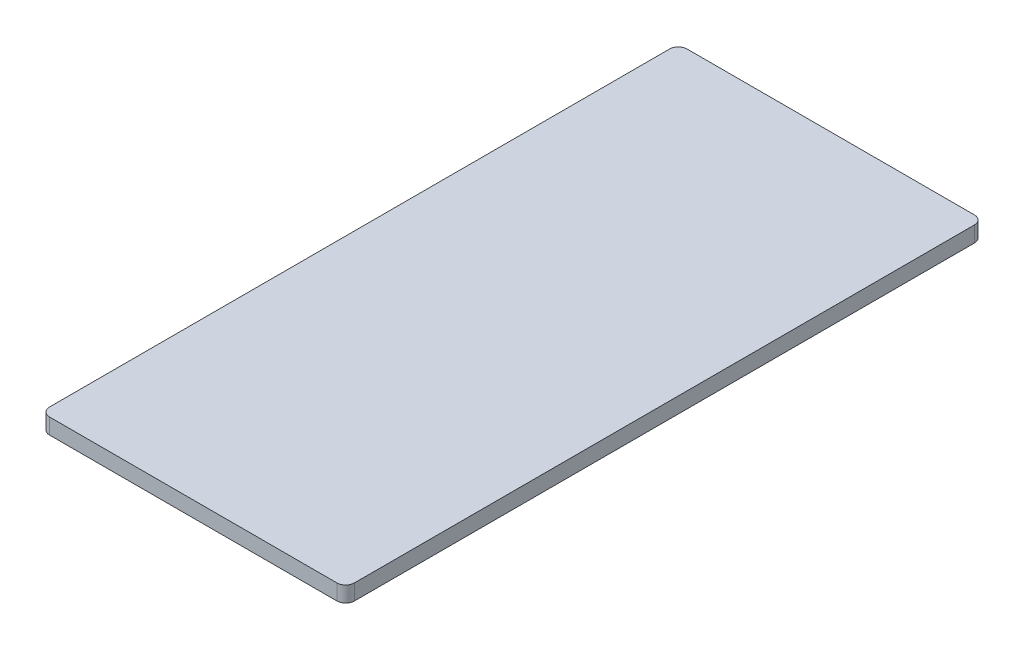
ISO-10303-21;
HEADER;
FILE_DESCRIPTION(('STEP AP214'),'2;1');
FILE_NAME('part.step','',(''),(''),'','','');
FILE_SCHEMA(('AUTOMOTIVE_DESIGN { 1 0 10303 214 1 1 1 1 }'));
ENDSEC;
DATA;
#1=APPLICATION_CONTEXT('core data for automotive mechanical design processes');
#2=APPLICATION_PROTOCOL_DEFINITION('international standard','automotive_design',2000,#1);
#3=PRODUCT_CONTEXT('',#1,'mechanical');
#4=PRODUCT('Part','Part','',(#3));
#5=PRODUCT_RELATED_PRODUCT_CATEGORY('part','',(#4));
#6=PRODUCT_DEFINITION_FORMATION('','',#4);
#7=PRODUCT_DEFINITION_CONTEXT('part definition',#1,'design');
#8=PRODUCT_DEFINITION('design','',#6,#7);
#9=PRODUCT_DEFINITION_SHAPE('','',#8);
#10=(LENGTH_UNIT() NAMED_UNIT(*) SI_UNIT(.MILLI.,.METRE.));
#11=(NAMED_UNIT(*) PLANE_ANGLE_UNIT() SI_UNIT($,.RADIAN.));
#12=(NAMED_UNIT(*) SI_UNIT($,.STERADIAN.) SOLID_ANGLE_UNIT());
#13=UNCERTAINTY_MEASURE_WITH_UNIT(LENGTH_MEASURE(1.E-05),#10,'distance_accuracy_value','');
#14=(GEOMETRIC_REPRESENTATION_CONTEXT(3) GLOBAL_UNCERTAINTY_ASSIGNED_CONTEXT((#13)) GLOBAL_UNIT_ASSIGNED_CONTEXT((#10,
#11,#12)) REPRESENTATION_CONTEXT('',''));
#15=CARTESIAN_POINT('',(0.,0.,0.));
#16=DIRECTION('',(0.,0.,1.));
#17=DIRECTION('',(1.,0.,0.));
#18=AXIS2_PLACEMENT_3D('',#15,#16,#17);
#19=CARTESIAN_POINT('',(-175.,18.,366.));
#20=DIRECTION('',(1.,0.,0.));
#21=DIRECTION('',(0.,0.,-1.));
#22=AXIS2_PLACEMENT_3D('',#19,#20,#21);
#23=PLANE('',#22);
#24=DIRECTION('',(0.,0.,1.));
#25=VECTOR('',#24,1.);
#26=CARTESIAN_POINT('',(-175.,18.,366.));
#27=LINE('',#26,#25);
#28=CARTESIAN_POINT('',(-175.,18.,-356.));
#29=VERTEX_POINT('',#28);
#30=CARTESIAN_POINT('',(-175.,18.,356.));
#31=VERTEX_POINT('',#30);
#32=EDGE_CURVE('E122',#29,#31,#27,.T.);
#33=ORIENTED_EDGE('',*,*,#32,.F.);
#34=DIRECTION('',(0.,-1.,0.));
#35=VECTOR('',#34,1.);
#36=CARTESIAN_POINT('',(-175.,18.,-356.));
#37=LINE('',#36,#35);
#38=CARTESIAN_POINT('',(-175.,0.,-356.));
#39=VERTEX_POINT('',#38);
#40=EDGE_CURVE('E107',#29,#39,#37,.T.);
#41=ORIENTED_EDGE('',*,*,#40,.T.);
#42=DIRECTION('',(0.,0.,1.));
#43=VECTOR('',#42,1.);
#44=CARTESIAN_POINT('',(-175.,0.,366.));
#45=LINE('',#44,#43);
#46=CARTESIAN_POINT('',(-175.,0.,356.));
#47=VERTEX_POINT('',#46);
#48=EDGE_CURVE('E119',#39,#47,#45,.T.);
#49=ORIENTED_EDGE('',*,*,#48,.T.);
#50=DIRECTION('',(0.,-1.,0.));
#51=VECTOR('',#50,1.);
#52=CARTESIAN_POINT('',(-175.,18.,356.));
#53=LINE('',#52,#51);
#54=EDGE_CURVE('E124',#47,#31,#53,.F.);
#55=ORIENTED_EDGE('',*,*,#54,.T.);
#56=EDGE_LOOP('',(#33,#41,#49,#55));
#57=FACE_BOUND('',#56,.T.);
#58=ADVANCED_FACE('F37',(#57),#23,.F.);
#59=CARTESIAN_POINT('',(-175.,18.,366.));
#60=DIRECTION('',(0.,0.,-1.));
#61=DIRECTION('',(-1.,0.,0.));
#62=AXIS2_PLACEMENT_3D('',#59,#60,#61);
#63=PLANE('',#62);
#64=DIRECTION('',(1.,0.,0.));
#65=VECTOR('',#64,1.);
#66=CARTESIAN_POINT('',(-175.,0.,366.));
#67=LINE('',#66,#65);
#68=CARTESIAN_POINT('',(-165.,0.,366.));
#69=VERTEX_POINT('',#68);
#70=CARTESIAN_POINT('',(165.,0.,366.));
#71=VERTEX_POINT('',#70);
#72=EDGE_CURVE('E128',#69,#71,#67,.T.);
#73=ORIENTED_EDGE('',*,*,#72,.T.);
#74=DIRECTION('',(0.,-1.,0.));
#75=VECTOR('',#74,1.);
#76=CARTESIAN_POINT('',(165.,18.,366.));
#77=LINE('',#76,#75);
#78=CARTESIAN_POINT('',(165.,18.,366.));
#79=VERTEX_POINT('',#78);
#80=EDGE_CURVE('E11',#71,#79,#77,.F.);
#81=ORIENTED_EDGE('',*,*,#80,.T.);
#82=DIRECTION('',(1.,0.,0.));
#83=VECTOR('',#82,1.);
#84=CARTESIAN_POINT('',(-175.,18.,366.));
#85=LINE('',#84,#83);
#86=CARTESIAN_POINT('',(-165.,18.,366.));
#87=VERTEX_POINT('',#86);
#88=EDGE_CURVE('E164',#87,#79,#85,.T.);
#89=ORIENTED_EDGE('',*,*,#88,.F.);
#90=DIRECTION('',(0.,-1.,0.));
#91=VECTOR('',#90,1.);
#92=CARTESIAN_POINT('',(-165.,18.,366.));
#93=LINE('',#92,#91);
#94=EDGE_CURVE('E45',#87,#69,#93,.T.);
#95=ORIENTED_EDGE('',*,*,#94,.T.);
#96=EDGE_LOOP('',(#73,#81,#89,#95));
#97=FACE_BOUND('',#96,.T.);
#98=ADVANCED_FACE('F162',(#97),#63,.F.);
#99=CARTESIAN_POINT('',(175.,18.,366.));
#100=DIRECTION('',(-1.,0.,0.));
#101=DIRECTION('',(0.,0.,1.));
#102=AXIS2_PLACEMENT_3D('',#99,#100,#101);
#103=PLANE('',#102);
#104=DIRECTION('',(0.,0.,-1.));
#105=VECTOR('',#104,1.);
#106=CARTESIAN_POINT('',(175.,0.,366.));
#107=LINE('',#106,#105);
#108=CARTESIAN_POINT('',(175.,0.,356.));
#109=VERTEX_POINT('',#108);
#110=CARTESIAN_POINT('',(175.,0.,-356.));
#111=VERTEX_POINT('',#110);
#112=EDGE_CURVE('E131',#109,#111,#107,.T.);
#113=ORIENTED_EDGE('',*,*,#112,.T.);
#114=DIRECTION('',(0.,-1.,0.));
#115=VECTOR('',#114,1.);
#116=CARTESIAN_POINT('',(175.,18.,-356.));
#117=LINE('',#116,#115);
#118=CARTESIAN_POINT('',(175.,18.,-356.));
#119=VERTEX_POINT('',#118);
#120=EDGE_CURVE('E52',#111,#119,#117,.F.);
#121=ORIENTED_EDGE('',*,*,#120,.T.);
#122=DIRECTION('',(0.,0.,-1.));
#123=VECTOR('',#122,1.);
#124=CARTESIAN_POINT('',(175.,18.,366.));
#125=LINE('',#124,#123);
#126=CARTESIAN_POINT('',(175.,18.,356.));
#127=VERTEX_POINT('',#126);
#128=EDGE_CURVE('E172',#127,#119,#125,.T.);
#129=ORIENTED_EDGE('',*,*,#128,.F.);
#130=DIRECTION('',(0.,-1.,0.));
#131=VECTOR('',#130,1.);
#132=CARTESIAN_POINT('',(175.,18.,356.));
#133=LINE('',#132,#131);
#134=EDGE_CURVE('E155',#127,#109,#133,.T.);
#135=ORIENTED_EDGE('',*,*,#134,.T.);
#136=EDGE_LOOP('',(#113,#121,#129,#135));
#137=FACE_BOUND('',#136,.T.);
#138=ADVANCED_FACE('F171',(#137),#103,.F.);
#139=CARTESIAN_POINT('',(-175.,18.,-366.));
#140=DIRECTION('',(0.,0.,1.));
#141=DIRECTION('',(1.,0.,0.));
#142=AXIS2_PLACEMENT_3D('',#139,#140,#141);
#143=PLANE('',#142);
#144=DIRECTION('',(-1.,0.,0.));
#145=VECTOR('',#144,1.);
#146=CARTESIAN_POINT('',(-175.,0.,-366.));
#147=LINE('',#146,#145);
#148=CARTESIAN_POINT('',(165.,0.,-366.));
#149=VERTEX_POINT('',#148);
#150=CARTESIAN_POINT('',(-165.,0.,-366.));
#151=VERTEX_POINT('',#150);
#152=EDGE_CURVE('E138',#149,#151,#147,.T.);
#153=ORIENTED_EDGE('',*,*,#152,.T.);
#154=DIRECTION('',(0.,-1.,0.));
#155=VECTOR('',#154,1.);
#156=CARTESIAN_POINT('',(-165.,18.,-366.));
#157=LINE('',#156,#155);
#158=CARTESIAN_POINT('',(-165.,18.,-366.));
#159=VERTEX_POINT('',#158);
#160=EDGE_CURVE('E108',#151,#159,#157,.F.);
#161=ORIENTED_EDGE('',*,*,#160,.T.);
#162=DIRECTION('',(-1.,0.,0.));
#163=VECTOR('',#162,1.);
#164=CARTESIAN_POINT('',(-175.,18.,-366.));
#165=LINE('',#164,#163);
#166=CARTESIAN_POINT('',(165.,18.,-366.));
#167=VERTEX_POINT('',#166);
#168=EDGE_CURVE('E134',#167,#159,#165,.T.);
#169=ORIENTED_EDGE('',*,*,#168,.F.);
#170=DIRECTION('',(0.,-1.,0.));
#171=VECTOR('',#170,1.);
#172=CARTESIAN_POINT('',(165.,18.,-366.));
#173=LINE('',#172,#171);
#174=EDGE_CURVE('E113',#167,#149,#173,.T.);
#175=ORIENTED_EDGE('',*,*,#174,.T.);
#176=EDGE_LOOP('',(#153,#161,#169,#175));
#177=FACE_BOUND('',#176,.T.);
#178=ADVANCED_FACE('F200',(#177),#143,.F.);
#179=CARTESIAN_POINT('',(0.,18.,0.));
#180=DIRECTION('',(0.,-1.,0.));
#181=DIRECTION('',(0.,0.,-1.));
#182=AXIS2_PLACEMENT_3D('',#179,#180,#181);
#183=PLANE('',#182);
#184=ORIENTED_EDGE('',*,*,#168,.T.);
#185=CARTESIAN_POINT('',(-165.,18.,-356.));
#186=DIRECTION('',(0.,-1.,0.));
#187=DIRECTION('',(0.,0.,-1.));
#188=AXIS2_PLACEMENT_3D('',#185,#186,#187);
#189=CIRCLE('',#188,10.);
#190=EDGE_CURVE('E153',#159,#29,#189,.F.);
#191=ORIENTED_EDGE('',*,*,#190,.T.);
#192=ORIENTED_EDGE('',*,*,#32,.T.);
#193=CARTESIAN_POINT('',(-165.,18.,356.));
#194=DIRECTION('',(0.,-1.,0.));
#195=DIRECTION('',(0.,0.,-1.));
#196=AXIS2_PLACEMENT_3D('',#193,#194,#195);
#197=CIRCLE('',#196,10.);
#198=EDGE_CURVE('E148',#31,#87,#197,.F.);
#199=ORIENTED_EDGE('',*,*,#198,.T.);
#200=ORIENTED_EDGE('',*,*,#88,.T.);
#201=CARTESIAN_POINT('',(165.,18.,356.));
#202=DIRECTION('',(0.,-1.,0.));
#203=DIRECTION('',(0.,0.,-1.));
#204=AXIS2_PLACEMENT_3D('',#201,#202,#203);
#205=CIRCLE('',#204,10.);
#206=EDGE_CURVE('E59',#79,#127,#205,.F.);
#207=ORIENTED_EDGE('',*,*,#206,.T.);
#208=ORIENTED_EDGE('',*,*,#128,.T.);
#209=CARTESIAN_POINT('',(165.,18.,-356.));
#210=DIRECTION('',(0.,-1.,0.));
#211=DIRECTION('',(0.,0.,-1.));
#212=AXIS2_PLACEMENT_3D('',#209,#210,#211);
#213=CIRCLE('',#212,10.);
#214=EDGE_CURVE('E151',#119,#167,#213,.F.);
#215=ORIENTED_EDGE('',*,*,#214,.T.);
#216=EDGE_LOOP('',(#184,#191,#192,#199,#200,#207,#208,#215));
#217=FACE_BOUND('',#216,.T.);
#218=ADVANCED_FACE('F177',(#217),#183,.F.);
#219=CARTESIAN_POINT('',(0.,0.,0.));
#220=DIRECTION('',(0.,-1.,0.));
#221=DIRECTION('',(0.,0.,-1.));
#222=AXIS2_PLACEMENT_3D('',#219,#220,#221);
#223=PLANE('',#222);
#224=ORIENTED_EDGE('',*,*,#48,.F.);
#225=CARTESIAN_POINT('',(-165.,0.,-356.));
#226=DIRECTION('',(0.,-1.,0.));
#227=DIRECTION('',(0.,0.,-1.));
#228=AXIS2_PLACEMENT_3D('',#225,#226,#227);
#229=CIRCLE('',#228,10.);
#230=EDGE_CURVE('E103',#39,#151,#229,.T.);
#231=ORIENTED_EDGE('',*,*,#230,.T.);
#232=ORIENTED_EDGE('',*,*,#152,.F.);
#233=CARTESIAN_POINT('',(165.,0.,-356.));
#234=DIRECTION('',(0.,-1.,0.));
#235=DIRECTION('',(0.,0.,-1.));
#236=AXIS2_PLACEMENT_3D('',#233,#234,#235);
#237=CIRCLE('',#236,10.);
#238=EDGE_CURVE('E114',#149,#111,#237,.T.);
#239=ORIENTED_EDGE('',*,*,#238,.T.);
#240=ORIENTED_EDGE('',*,*,#112,.F.);
#241=CARTESIAN_POINT('',(165.,0.,356.));
#242=DIRECTION('',(0.,-1.,0.));
#243=DIRECTION('',(0.,0.,-1.));
#244=AXIS2_PLACEMENT_3D('',#241,#242,#243);
#245=CIRCLE('',#244,10.);
#246=EDGE_CURVE('E142',#109,#71,#245,.T.);
#247=ORIENTED_EDGE('',*,*,#246,.T.);
#248=ORIENTED_EDGE('',*,*,#72,.F.);
#249=CARTESIAN_POINT('',(-165.,0.,356.));
#250=DIRECTION('',(0.,-1.,0.));
#251=DIRECTION('',(0.,0.,-1.));
#252=AXIS2_PLACEMENT_3D('',#249,#250,#251);
#253=CIRCLE('',#252,10.);
#254=EDGE_CURVE('E123',#69,#47,#253,.T.);
#255=ORIENTED_EDGE('',*,*,#254,.T.);
#256=EDGE_LOOP('',(#224,#231,#232,#239,#240,#247,#248,#255));
#257=FACE_BOUND('',#256,.T.);
#258=ADVANCED_FACE('F126',(#257),#223,.T.);
#259=CARTESIAN_POINT('',(-165.,18.,-356.));
#260=DIRECTION('',(0.,-1.,0.));
#261=DIRECTION('',(0.,0.,-1.));
#262=AXIS2_PLACEMENT_3D('',#259,#260,#261);
#263=CYLINDRICAL_SURFACE('',#262,10.);
#264=ORIENTED_EDGE('',*,*,#190,.F.);
#265=ORIENTED_EDGE('',*,*,#160,.F.);
#266=ORIENTED_EDGE('',*,*,#230,.F.);
#267=ORIENTED_EDGE('',*,*,#40,.F.);
#268=EDGE_LOOP('',(#264,#265,#266,#267));
#269=FACE_BOUND('',#268,.T.);
#270=ADVANCED_FACE('F106',(#269),#263,.T.);
#271=CARTESIAN_POINT('',(165.,18.,-356.));
#272=DIRECTION('',(0.,-1.,0.));
#273=DIRECTION('',(0.,0.,-1.));
#274=AXIS2_PLACEMENT_3D('',#271,#272,#273);
#275=CYLINDRICAL_SURFACE('',#274,10.);
#276=ORIENTED_EDGE('',*,*,#214,.F.);
#277=ORIENTED_EDGE('',*,*,#120,.F.);
#278=ORIENTED_EDGE('',*,*,#238,.F.);
#279=ORIENTED_EDGE('',*,*,#174,.F.);
#280=EDGE_LOOP('',(#276,#277,#278,#279));
#281=FACE_BOUND('',#280,.T.);
#282=ADVANCED_FACE('F182',(#281),#275,.T.);
#283=CARTESIAN_POINT('',(165.,18.,356.));
#284=DIRECTION('',(0.,-1.,0.));
#285=DIRECTION('',(0.,0.,-1.));
#286=AXIS2_PLACEMENT_3D('',#283,#284,#285);
#287=CYLINDRICAL_SURFACE('',#286,10.);
#288=ORIENTED_EDGE('',*,*,#206,.F.);
#289=ORIENTED_EDGE('',*,*,#80,.F.);
#290=ORIENTED_EDGE('',*,*,#246,.F.);
#291=ORIENTED_EDGE('',*,*,#134,.F.);
#292=EDGE_LOOP('',(#288,#289,#290,#291));
#293=FACE_BOUND('',#292,.T.);
#294=ADVANCED_FACE('F170',(#293),#287,.T.);
#295=CARTESIAN_POINT('',(-165.,18.,356.));
#296=DIRECTION('',(0.,-1.,0.));
#297=DIRECTION('',(0.,0.,-1.));
#298=AXIS2_PLACEMENT_3D('',#295,#296,#297);
#299=CYLINDRICAL_SURFACE('',#298,10.);
#300=ORIENTED_EDGE('',*,*,#198,.F.);
#301=ORIENTED_EDGE('',*,*,#54,.F.);
#302=ORIENTED_EDGE('',*,*,#254,.F.);
#303=ORIENTED_EDGE('',*,*,#94,.F.);
#304=EDGE_LOOP('',(#300,#301,#302,#303));
#305=FACE_BOUND('',#304,.T.);
#306=ADVANCED_FACE('F39',(#305),#299,.T.);
#307=CLOSED_SHELL('',(#58,#98,#138,#178,#218,#258,#270,#282,#294,#306));
#308=MANIFOLD_SOLID_BREP('B2',#307);
#309=ADVANCED_BREP_SHAPE_REPRESENTATION('',(#18,#308),#14);
#310=SHAPE_DEFINITION_REPRESENTATION(#9,#309);
ENDSEC;
END-ISO-10303-21;
